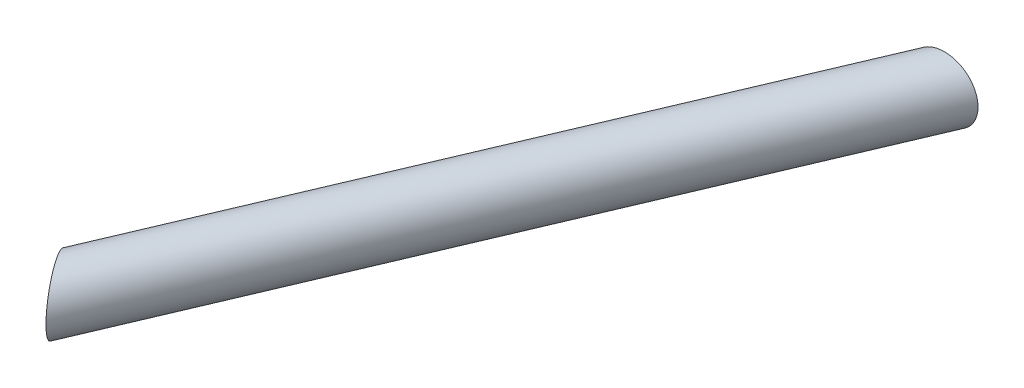
ISO-10303-21;
HEADER;
FILE_DESCRIPTION(('STEP AP214'),'2;1');
FILE_NAME('part.step','',(''),(''),'','','');
FILE_SCHEMA(('AUTOMOTIVE_DESIGN { 1 0 10303 214 1 1 1 1 }'));
ENDSEC;
DATA;
#1=APPLICATION_CONTEXT('core data for automotive mechanical design processes');
#2=APPLICATION_PROTOCOL_DEFINITION('international standard','automotive_design',2000,#1);
#3=PRODUCT_CONTEXT('',#1,'mechanical');
#4=PRODUCT('Part','Part','',(#3));
#5=PRODUCT_RELATED_PRODUCT_CATEGORY('part','',(#4));
#6=PRODUCT_DEFINITION_FORMATION('','',#4);
#7=PRODUCT_DEFINITION_CONTEXT('part definition',#1,'design');
#8=PRODUCT_DEFINITION('design','',#6,#7);
#9=PRODUCT_DEFINITION_SHAPE('','',#8);
#10=(LENGTH_UNIT() NAMED_UNIT(*) SI_UNIT(.MILLI.,.METRE.));
#11=(NAMED_UNIT(*) PLANE_ANGLE_UNIT() SI_UNIT($,.RADIAN.));
#12=(NAMED_UNIT(*) SI_UNIT($,.STERADIAN.) SOLID_ANGLE_UNIT());
#13=UNCERTAINTY_MEASURE_WITH_UNIT(LENGTH_MEASURE(1.E-05),#10,'distance_accuracy_value','');
#14=(GEOMETRIC_REPRESENTATION_CONTEXT(3) GLOBAL_UNCERTAINTY_ASSIGNED_CONTEXT((#13)) GLOBAL_UNIT_ASSIGNED_CONTEXT((#10,
#11,#12)) REPRESENTATION_CONTEXT('',''));
#15=CARTESIAN_POINT('',(0.,0.,0.));
#16=DIRECTION('',(0.,0.,1.));
#17=DIRECTION('',(1.,0.,0.));
#18=AXIS2_PLACEMENT_3D('',#15,#16,#17);
#19=CARTESIAN_POINT('',(65.,0.,0.));
#20=DIRECTION('',(0.391140640344852,0.,-0.920330918458475));
#21=DIRECTION('',(-0.920330918458475,0.,-0.391140640344852));
#22=AXIS2_PLACEMENT_3D('',#19,#20,#21);
#23=CYLINDRICAL_SURFACE('',#22,7.9);
#24=CARTESIAN_POINT('',(145.75,0.,-190.));
#25=DIRECTION('',(0.,0.,-1.));
#26=DIRECTION('',(1.,0.,0.));
#27=AXIS2_PLACEMENT_3D('',#24,#25,#26);
#28=ELLIPSE('',#27,8.58386895577979,7.9);
#29=CARTESIAN_POINT('',(147.029203505381,-7.81178513474894,-190.));
#30=VERTEX_POINT('',#29);
#31=CARTESIAN_POINT('',(151.992167087327,5.42278441710752,-190.));
#32=VERTEX_POINT('',#31);
#33=EDGE_CURVE('E59',#30,#32,#28,.T.);
#34=ORIENTED_EDGE('',*,*,#33,.T.);
#35=CARTESIAN_POINT('',(145.762937346756,0.,-190.030440815897));
#36=DIRECTION('',(0.00725504842418489,-0.00272064315906933,-0.999969980736004));
#37=DIRECTION('',(0.999952473211164,0.00653261113243015,0.00723714796509747));
#38=AXIS2_PLACEMENT_3D('',#35,#36,#37);
#39=ELLIPSE('',#38,8.55773895832352,7.9);
#40=EDGE_CURVE('E79',#32,#30,#39,.T.);
#41=ORIENTED_EDGE('',*,*,#40,.T.);
#42=EDGE_LOOP('',(#34,#41));
#43=FACE_BOUND('',#42,.T.);
#44=CARTESIAN_POINT('',(65.,0.,0.));
#45=DIRECTION('',(-0.834008585191079,0.,0.551751465632466));
#46=DIRECTION('',(-0.551751465632466,0.,-0.834008585191079));
#47=AXIS2_PLACEMENT_3D('',#44,#45,#46);
#48=ELLIPSE('',#47,9.47232455429705,7.9);
#49=CARTESIAN_POINT('',(59.7736310442203,0.,-7.89999999999997));
#50=VERTEX_POINT('',#49);
#51=EDGE_CURVE('E45',#50,#50,#48,.T.);
#52=ORIENTED_EDGE('',*,*,#51,.T.);
#53=EDGE_LOOP('',(#52));
#54=FACE_BOUND('',#53,.T.);
#55=ADVANCED_FACE('F41',(#43,#54),#23,.F.);
#56=CARTESIAN_POINT('',(65.,0.,0.));
#57=DIRECTION('',(0.391140640344852,0.,-0.920330918458475));
#58=DIRECTION('',(-0.920330918458475,0.,-0.391140640344852));
#59=AXIS2_PLACEMENT_3D('',#56,#57,#58);
#60=CYLINDRICAL_SURFACE('',#59,9.5);
#61=CARTESIAN_POINT('',(145.762937346756,0.,-190.030440815897));
#62=DIRECTION('',(0.00725504842418489,-0.00272064315906933,-0.999969980736004));
#63=DIRECTION('',(0.999952473211164,0.00653261113243015,0.00723714796509747));
#64=AXIS2_PLACEMENT_3D('',#61,#62,#63);
#65=ELLIPSE('',#64,10.290951911908,9.5);
#66=CARTESIAN_POINT('',(152.618106333548,7.09195574036234,-190.));
#67=VERTEX_POINT('',#66);
#68=CARTESIAN_POINT('',(146.40326425916,-9.48095645800376,-190.));
#69=VERTEX_POINT('',#68);
#70=EDGE_CURVE('E77',#67,#69,#65,.T.);
#71=ORIENTED_EDGE('',*,*,#70,.F.);
#72=CARTESIAN_POINT('',(145.75,0.,-190.));
#73=DIRECTION('',(0.,0.,-1.));
#74=DIRECTION('',(1.,0.,0.));
#75=AXIS2_PLACEMENT_3D('',#72,#73,#74);
#76=ELLIPSE('',#75,10.3223740607478,9.5);
#77=EDGE_CURVE('E68',#69,#67,#76,.T.);
#78=ORIENTED_EDGE('',*,*,#77,.F.);
#79=EDGE_LOOP('',(#71,#78));
#80=FACE_BOUND('',#79,.T.);
#81=CARTESIAN_POINT('',(65.,0.,0.));
#82=DIRECTION('',(-0.834008585191079,0.,0.551751465632466));
#83=DIRECTION('',(-0.551751465632466,0.,-0.834008585191079));
#84=AXIS2_PLACEMENT_3D('',#81,#82,#83);
#85=ELLIPSE('',#84,11.3907700336483,9.5);
#86=CARTESIAN_POINT('',(58.7151259392522,0.,-9.49999999999996));
#87=VERTEX_POINT('',#86);
#88=EDGE_CURVE('E11',#87,#87,#85,.T.);
#89=ORIENTED_EDGE('',*,*,#88,.F.);
#90=EDGE_LOOP('',(#89));
#91=FACE_BOUND('',#90,.T.);
#92=ADVANCED_FACE('F81',(#80,#91),#60,.T.);
#93=CARTESIAN_POINT('',(234.290460212321,196.51607742038,-189.922816241504));
#94=DIRECTION('',(0.00725504842418489,-0.00272064315906933,-0.999969980736004));
#95=DIRECTION('',(-0.999973681595049,0.,-0.00725507527490251));
#96=AXIS2_PLACEMENT_3D('',#93,#94,#95);
#97=PLANE('',#96);
#98=DIRECTION('',(-0.351123441588392,-0.936329177569045,0.));
#99=VECTOR('',#98,1.);
#100=CARTESIAN_POINT('',(146.676052980525,-8.75351986769697,-190.));
#101=LINE('',#100,#99);
#102=EDGE_CURVE('E51',#67,#32,#101,.T.);
#103=ORIENTED_EDGE('',*,*,#102,.F.);
#104=ORIENTED_EDGE('',*,*,#70,.T.);
#105=EDGE_CURVE('E65',#30,#69,#101,.T.);
#106=ORIENTED_EDGE('',*,*,#105,.F.);
#107=ORIENTED_EDGE('',*,*,#40,.F.);
#108=EDGE_LOOP('',(#103,#104,#106,#107));
#109=FACE_BOUND('',#108,.T.);
#110=ADVANCED_FACE('F76',(#109),#97,.T.);
#111=CARTESIAN_POINT('',(150.,-10.,-190.));
#112=DIRECTION('',(0.,0.,-1.));
#113=DIRECTION('',(-1.,0.,0.));
#114=AXIS2_PLACEMENT_3D('',#111,#112,#113);
#115=PLANE('',#114);
#116=ORIENTED_EDGE('',*,*,#105,.T.);
#117=ORIENTED_EDGE('',*,*,#77,.T.);
#118=ORIENTED_EDGE('',*,*,#102,.T.);
#119=ORIENTED_EDGE('',*,*,#33,.F.);
#120=EDGE_LOOP('',(#116,#117,#118,#119));
#121=FACE_BOUND('',#120,.T.);
#122=ADVANCED_FACE('F70',(#121),#115,.T.);
#123=CARTESIAN_POINT('',(65.,0.,0.));
#124=DIRECTION('',(-0.834008585191079,0.,0.551751465632466));
#125=DIRECTION('',(0.551751465632466,0.,0.834008585191079));
#126=AXIS2_PLACEMENT_3D('',#123,#124,#125);
#127=PLANE('',#126);
#128=ORIENTED_EDGE('',*,*,#51,.F.);
#129=EDGE_LOOP('',(#128));
#130=FACE_BOUND('',#129,.T.);
#131=ORIENTED_EDGE('',*,*,#88,.T.);
#132=EDGE_LOOP('',(#131));
#133=FACE_BOUND('',#132,.T.);
#134=ADVANCED_FACE('F43',(#130,#133),#127,.T.);
#135=CLOSED_SHELL('',(#55,#92,#110,#122,#134));
#136=MANIFOLD_SOLID_BREP('B2',#135);
#137=ADVANCED_BREP_SHAPE_REPRESENTATION('',(#18,#136),#14);
#138=SHAPE_DEFINITION_REPRESENTATION(#9,#137);
ENDSEC;
END-ISO-10303-21;
